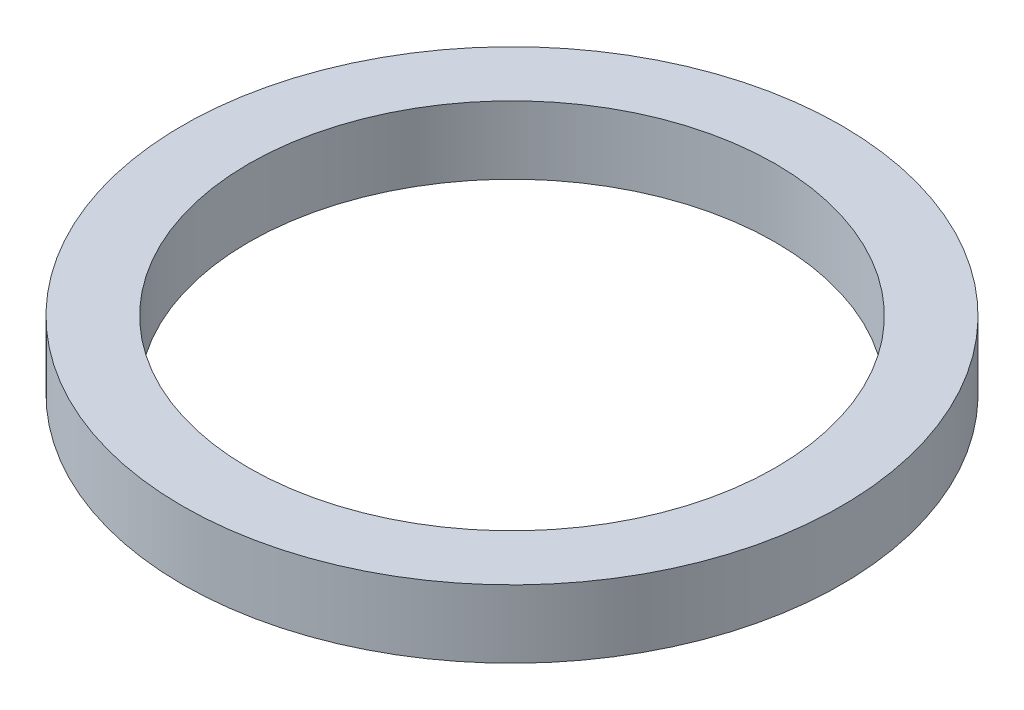
ISO-10303-21;
HEADER;
FILE_DESCRIPTION(('STEP AP214'),'2;1');
FILE_NAME('part.step','',(''),(''),'','','');
FILE_SCHEMA(('AUTOMOTIVE_DESIGN { 1 0 10303 214 1 1 1 1 }'));
ENDSEC;
DATA;
#1=APPLICATION_CONTEXT('core data for automotive mechanical design processes');
#2=APPLICATION_PROTOCOL_DEFINITION('international standard','automotive_design',2000,#1);
#3=PRODUCT_CONTEXT('',#1,'mechanical');
#4=PRODUCT('Part','Part','',(#3));
#5=PRODUCT_RELATED_PRODUCT_CATEGORY('part','',(#4));
#6=PRODUCT_DEFINITION_FORMATION('','',#4);
#7=PRODUCT_DEFINITION_CONTEXT('part definition',#1,'design');
#8=PRODUCT_DEFINITION('design','',#6,#7);
#9=PRODUCT_DEFINITION_SHAPE('','',#8);
#10=(LENGTH_UNIT() NAMED_UNIT(*) SI_UNIT(.MILLI.,.METRE.));
#11=(NAMED_UNIT(*) PLANE_ANGLE_UNIT() SI_UNIT($,.RADIAN.));
#12=(NAMED_UNIT(*) SI_UNIT($,.STERADIAN.) SOLID_ANGLE_UNIT());
#13=UNCERTAINTY_MEASURE_WITH_UNIT(LENGTH_MEASURE(1.E-05),#10,'distance_accuracy_value','');
#14=(GEOMETRIC_REPRESENTATION_CONTEXT(3) GLOBAL_UNCERTAINTY_ASSIGNED_CONTEXT((#13)) GLOBAL_UNIT_ASSIGNED_CONTEXT((#10,
#11,#12)) REPRESENTATION_CONTEXT('',''));
#15=CARTESIAN_POINT('',(0.,0.,0.));
#16=DIRECTION('',(0.,0.,1.));
#17=DIRECTION('',(1.,0.,0.));
#18=AXIS2_PLACEMENT_3D('',#15,#16,#17);
#19=CARTESIAN_POINT('',(0.,2.6162,0.));
#20=DIRECTION('',(0.,1.,0.));
#21=DIRECTION('',(0.,0.,1.));
#22=AXIS2_PLACEMENT_3D('',#19,#20,#21);
#23=PLANE('',#22);
#24=CARTESIAN_POINT('',(0.,2.6162,0.));
#25=DIRECTION('',(0.,1.,0.));
#26=DIRECTION('',(0.,0.,1.));
#27=AXIS2_PLACEMENT_3D('',#24,#25,#26);
#28=CIRCLE('',#27,12.7);
#29=CARTESIAN_POINT('',(0.,2.6162,12.7));
#30=VERTEX_POINT('',#29);
#31=EDGE_CURVE('E10',#30,#30,#28,.T.);
#32=ORIENTED_EDGE('',*,*,#31,.T.);
#33=EDGE_LOOP('',(#32));
#34=FACE_BOUND('',#33,.T.);
#35=CARTESIAN_POINT('',(0.,2.6162,0.));
#36=DIRECTION('',(0.,1.,0.));
#37=DIRECTION('',(0.,0.,1.));
#38=AXIS2_PLACEMENT_3D('',#35,#36,#37);
#39=CIRCLE('',#38,10.1473);
#40=CARTESIAN_POINT('',(0.,2.6162,10.1473));
#41=VERTEX_POINT('',#40);
#42=EDGE_CURVE('E43',#41,#41,#39,.T.);
#43=ORIENTED_EDGE('',*,*,#42,.F.);
#44=EDGE_LOOP('',(#43));
#45=FACE_BOUND('',#44,.T.);
#46=ADVANCED_FACE('F32',(#34,#45),#23,.T.);
#47=CARTESIAN_POINT('',(0.,0.,0.));
#48=DIRECTION('',(0.,1.,0.));
#49=DIRECTION('',(0.,0.,1.));
#50=AXIS2_PLACEMENT_3D('',#47,#48,#49);
#51=PLANE('',#50);
#52=CARTESIAN_POINT('',(0.,0.,0.));
#53=DIRECTION('',(0.,1.,0.));
#54=DIRECTION('',(0.,0.,1.));
#55=AXIS2_PLACEMENT_3D('',#52,#53,#54);
#56=CIRCLE('',#55,12.7);
#57=CARTESIAN_POINT('',(0.,0.,12.7));
#58=VERTEX_POINT('',#57);
#59=EDGE_CURVE('E36',#58,#58,#56,.T.);
#60=ORIENTED_EDGE('',*,*,#59,.F.);
#61=EDGE_LOOP('',(#60));
#62=FACE_BOUND('',#61,.T.);
#63=CARTESIAN_POINT('',(0.,0.,0.));
#64=DIRECTION('',(0.,1.,0.));
#65=DIRECTION('',(0.,0.,1.));
#66=AXIS2_PLACEMENT_3D('',#63,#64,#65);
#67=CIRCLE('',#66,10.1473);
#68=CARTESIAN_POINT('',(0.,0.,10.1473));
#69=VERTEX_POINT('',#68);
#70=EDGE_CURVE('E45',#69,#69,#67,.T.);
#71=ORIENTED_EDGE('',*,*,#70,.T.);
#72=EDGE_LOOP('',(#71));
#73=FACE_BOUND('',#72,.T.);
#74=ADVANCED_FACE('F55',(#62,#73),#51,.F.);
#75=CARTESIAN_POINT('',(0.,2.6162,0.));
#76=DIRECTION('',(0.,-1.,0.));
#77=DIRECTION('',(0.,0.,-1.));
#78=AXIS2_PLACEMENT_3D('',#75,#76,#77);
#79=CYLINDRICAL_SURFACE('',#78,12.7);
#80=ORIENTED_EDGE('',*,*,#31,.F.);
#81=EDGE_LOOP('',(#80));
#82=FACE_BOUND('',#81,.T.);
#83=ORIENTED_EDGE('',*,*,#59,.T.);
#84=EDGE_LOOP('',(#83));
#85=FACE_BOUND('',#84,.T.);
#86=ADVANCED_FACE('F34',(#82,#85),#79,.T.);
#87=CARTESIAN_POINT('',(0.,2.6162,0.));
#88=DIRECTION('',(0.,-1.,0.));
#89=DIRECTION('',(0.,0.,-1.));
#90=AXIS2_PLACEMENT_3D('',#87,#88,#89);
#91=CYLINDRICAL_SURFACE('',#90,10.1473);
#92=ORIENTED_EDGE('',*,*,#42,.T.);
#93=EDGE_LOOP('',(#92));
#94=FACE_BOUND('',#93,.T.);
#95=ORIENTED_EDGE('',*,*,#70,.F.);
#96=EDGE_LOOP('',(#95));
#97=FACE_BOUND('',#96,.T.);
#98=ADVANCED_FACE('F51',(#94,#97),#91,.F.);
#99=CLOSED_SHELL('',(#46,#74,#86,#98));
#100=MANIFOLD_SOLID_BREP('B2',#99);
#101=ADVANCED_BREP_SHAPE_REPRESENTATION('',(#18,#100),#14);
#102=SHAPE_DEFINITION_REPRESENTATION(#9,#101);
ENDSEC;
END-ISO-10303-21;
